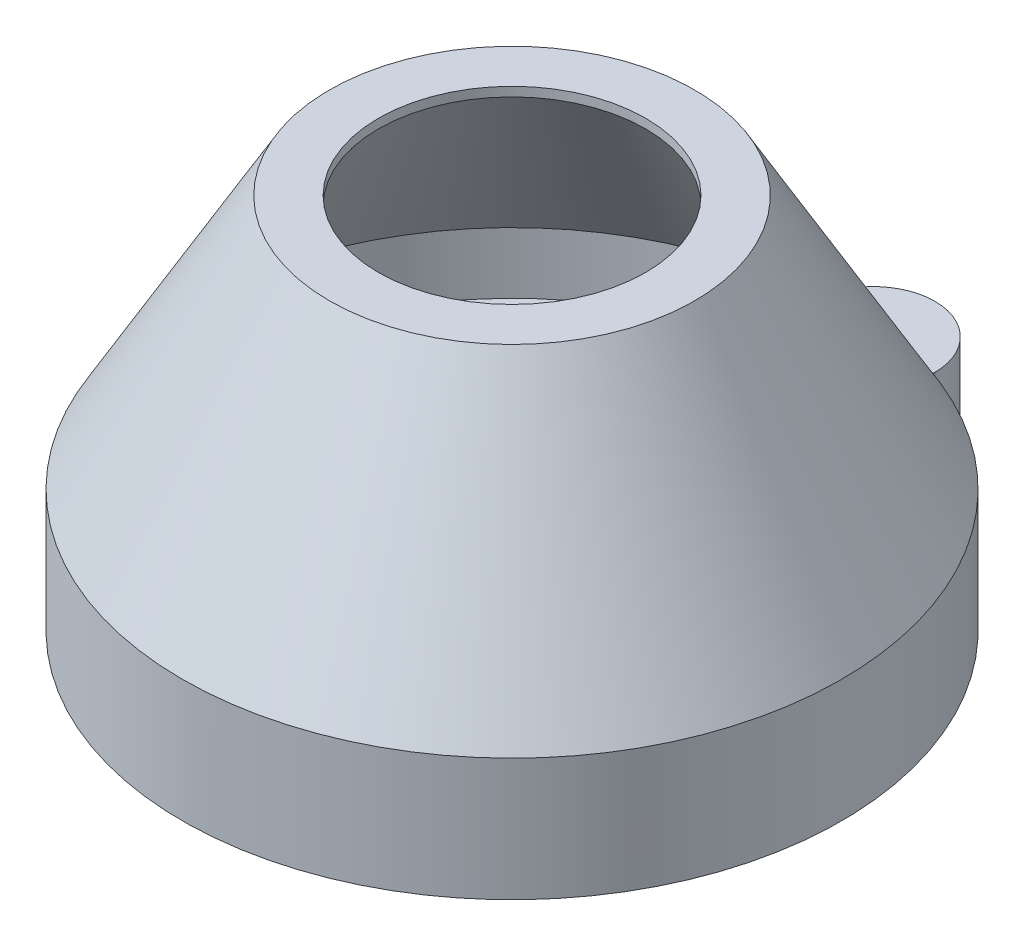
ISO-10303-21;
HEADER;
FILE_DESCRIPTION(('STEP AP214'),'2;1');
FILE_NAME('part.step','',(''),(''),'','','');
FILE_SCHEMA(('AUTOMOTIVE_DESIGN { 1 0 10303 214 1 1 1 1 }'));
ENDSEC;
DATA;
#1=APPLICATION_CONTEXT('core data for automotive mechanical design processes');
#2=APPLICATION_PROTOCOL_DEFINITION('international standard','automotive_design',2000,#1);
#3=PRODUCT_CONTEXT('',#1,'mechanical');
#4=PRODUCT('Part','Part','',(#3));
#5=PRODUCT_RELATED_PRODUCT_CATEGORY('part','',(#4));
#6=PRODUCT_DEFINITION_FORMATION('','',#4);
#7=PRODUCT_DEFINITION_CONTEXT('part definition',#1,'design');
#8=PRODUCT_DEFINITION('design','',#6,#7);
#9=PRODUCT_DEFINITION_SHAPE('','',#8);
#10=(LENGTH_UNIT() NAMED_UNIT(*) SI_UNIT(.MILLI.,.METRE.));
#11=(NAMED_UNIT(*) PLANE_ANGLE_UNIT() SI_UNIT($,.RADIAN.));
#12=(NAMED_UNIT(*) SI_UNIT($,.STERADIAN.) SOLID_ANGLE_UNIT());
#13=UNCERTAINTY_MEASURE_WITH_UNIT(LENGTH_MEASURE(1.E-05),#10,'distance_accuracy_value','');
#14=(GEOMETRIC_REPRESENTATION_CONTEXT(3) GLOBAL_UNCERTAINTY_ASSIGNED_CONTEXT((#13)) GLOBAL_UNIT_ASSIGNED_CONTEXT((#10,
#11,#12)) REPRESENTATION_CONTEXT('',''));
#15=CARTESIAN_POINT('',(0.,0.,0.));
#16=DIRECTION('',(0.,0.,1.));
#17=DIRECTION('',(1.,0.,0.));
#18=AXIS2_PLACEMENT_3D('',#15,#16,#17);
#19=CARTESIAN_POINT('',(0.,10.,0.));
#20=DIRECTION('',(0.,-1.,0.));
#21=DIRECTION('',(0.,0.,-1.));
#22=AXIS2_PLACEMENT_3D('',#19,#20,#21);
#23=CYLINDRICAL_SURFACE('',#22,26.128);
#24=CARTESIAN_POINT('',(0.,10.,0.));
#25=DIRECTION('',(0.,1.,0.));
#26=DIRECTION('',(0.,0.,1.));
#27=AXIS2_PLACEMENT_3D('',#24,#25,#26);
#28=CIRCLE('',#27,26.128);
#29=CARTESIAN_POINT('',(0.,10.,26.128));
#30=VERTEX_POINT('',#29);
#31=EDGE_CURVE('E123',#30,#30,#28,.T.);
#32=ORIENTED_EDGE('',*,*,#31,.T.);
#33=EDGE_LOOP('',(#32));
#34=FACE_BOUND('',#33,.T.);
#35=CARTESIAN_POINT('',(0.,5.,0.));
#36=DIRECTION('',(0.,-1.,0.));
#37=DIRECTION('',(0.,0.,-1.));
#38=AXIS2_PLACEMENT_3D('',#35,#36,#37);
#39=CIRCLE('',#38,26.128);
#40=CARTESIAN_POINT('',(0.,5.,-26.128));
#41=VERTEX_POINT('',#40);
#42=EDGE_CURVE('E119',#41,#41,#39,.T.);
#43=ORIENTED_EDGE('',*,*,#42,.T.);
#44=EDGE_LOOP('',(#43));
#45=FACE_BOUND('',#44,.T.);
#46=ADVANCED_FACE('F34',(#34,#45),#23,.F.);
#47=CARTESIAN_POINT('',(-0.525640836433946,5.5,-29.9953946750342));
#48=DIRECTION('',(0.,-1.,0.));
#49=DIRECTION('',(0.,0.,-1.));
#50=AXIS2_PLACEMENT_3D('',#47,#48,#49);
#51=CYLINDRICAL_SURFACE('',#50,1.5);
#52=CARTESIAN_POINT('',(-0.525640836433946,5.5,-29.9953946750342));
#53=DIRECTION('',(0.,-1.,0.));
#54=DIRECTION('',(0.,0.,-1.));
#55=AXIS2_PLACEMENT_3D('',#52,#53,#54);
#56=CIRCLE('',#55,1.5);
#57=CARTESIAN_POINT('',(-0.525640836433946,5.5,-31.4953946750343));
#58=VERTEX_POINT('',#57);
#59=EDGE_CURVE('E159',#58,#58,#56,.T.);
#60=ORIENTED_EDGE('',*,*,#59,.F.);
#61=EDGE_LOOP('',(#60));
#62=FACE_BOUND('',#61,.T.);
#63=CARTESIAN_POINT('',(-0.525640836433946,3.5,-29.9953946750342));
#64=DIRECTION('',(0.,-1.,0.));
#65=DIRECTION('',(0.,0.,-1.));
#66=AXIS2_PLACEMENT_3D('',#63,#64,#65);
#67=CIRCLE('',#66,1.5);
#68=CARTESIAN_POINT('',(-0.525640836433946,3.5,-31.4953946750343));
#69=VERTEX_POINT('',#68);
#70=EDGE_CURVE('E156',#69,#69,#67,.F.);
#71=ORIENTED_EDGE('',*,*,#70,.F.);
#72=EDGE_LOOP('',(#71));
#73=FACE_BOUND('',#72,.T.);
#74=ADVANCED_FACE('F198',(#62,#73),#51,.F.);
#75=CARTESIAN_POINT('',(0.,0.,0.));
#76=DIRECTION('',(0.,1.,0.));
#77=DIRECTION('',(0.,0.,1.));
#78=AXIS2_PLACEMENT_3D('',#75,#76,#77);
#79=PLANE('',#78);
#80=CARTESIAN_POINT('',(0.,0.,0.));
#81=DIRECTION('',(0.,1.,0.));
#82=DIRECTION('',(0.,0.,1.));
#83=AXIS2_PLACEMENT_3D('',#80,#81,#82);
#84=CIRCLE('',#83,26.878);
#85=CARTESIAN_POINT('',(-5.54316219764841,0.,-26.3001946162108));
#86=VERTEX_POINT('',#85);
#87=CARTESIAN_POINT('',(4.49188052477975,0.,-26.4999979877566));
#88=VERTEX_POINT('',#87);
#89=EDGE_CURVE('E189',#86,#88,#84,.T.);
#90=ORIENTED_EDGE('',*,*,#89,.F.);
#91=DIRECTION('',(0.,0.,-1.));
#92=VECTOR('',#91,1.);
#93=CARTESIAN_POINT('',(-5.54316219764841,0.,-29.9953946750342));
#94=LINE('',#93,#92);
#95=CARTESIAN_POINT('',(-5.54316219764841,0.,-29.9953946750342));
#96=VERTEX_POINT('',#95);
#97=EDGE_CURVE('E167',#86,#96,#94,.T.);
#98=ORIENTED_EDGE('',*,*,#97,.T.);
#99=CARTESIAN_POINT('',(-0.525640836433946,0.,-29.9953946750342));
#100=DIRECTION('',(0.,-1.,0.));
#101=DIRECTION('',(0.,0.,-1.));
#102=AXIS2_PLACEMENT_3D('',#99,#100,#101);
#103=CIRCLE('',#102,5.01752136121446);
#104=CARTESIAN_POINT('',(4.49188052478052,0.,-29.9953946750342));
#105=VERTEX_POINT('',#104);
#106=EDGE_CURVE('E162',#96,#105,#103,.T.);
#107=ORIENTED_EDGE('',*,*,#106,.T.);
#108=DIRECTION('',(0.,0.,1.));
#109=VECTOR('',#108,1.);
#110=CARTESIAN_POINT('',(4.49188052478052,0.,-29.9953946750342));
#111=LINE('',#110,#109);
#112=EDGE_CURVE('E176',#105,#88,#111,.T.);
#113=ORIENTED_EDGE('',*,*,#112,.T.);
#114=EDGE_LOOP('',(#90,#98,#107,#113));
#115=FACE_BOUND('',#114,.T.);
#116=CARTESIAN_POINT('',(-0.525640836433946,0.,-29.9953946750342));
#117=DIRECTION('',(0.,-1.,0.));
#118=DIRECTION('',(0.,0.,-1.));
#119=AXIS2_PLACEMENT_3D('',#116,#117,#118);
#120=CIRCLE('',#119,4.1844923609099);
#121=CARTESIAN_POINT('',(-4.71013319734384,0.,-29.9953946750342));
#122=VERTEX_POINT('',#121);
#123=CARTESIAN_POINT('',(3.65885152447595,0.,-29.9953946750342));
#124=VERTEX_POINT('',#123);
#125=EDGE_CURVE('E144',#122,#124,#120,.T.);
#126=ORIENTED_EDGE('',*,*,#125,.F.);
#127=DIRECTION('',(0.,0.,-1.));
#128=VECTOR('',#127,1.);
#129=CARTESIAN_POINT('',(-4.71013319734384,0.,-29.9953946750342));
#130=LINE('',#129,#128);
#131=CARTESIAN_POINT('',(-4.71013319734384,0.,-25.6999422035008));
#132=VERTEX_POINT('',#131);
#133=EDGE_CURVE('E145',#132,#122,#130,.T.);
#134=ORIENTED_EDGE('',*,*,#133,.F.);
#135=CARTESIAN_POINT('',(0.,0.,0.));
#136=DIRECTION('',(0.,1.,0.));
#137=DIRECTION('',(0.,0.,1.));
#138=AXIS2_PLACEMENT_3D('',#135,#136,#137);
#139=CIRCLE('',#138,26.128);
#140=CARTESIAN_POINT('',(3.65885152447595,0.,-25.8705467573038));
#141=VERTEX_POINT('',#140);
#142=EDGE_CURVE('E183',#132,#141,#139,.T.);
#143=ORIENTED_EDGE('',*,*,#142,.T.);
#144=DIRECTION('',(0.,0.,1.));
#145=VECTOR('',#144,1.);
#146=CARTESIAN_POINT('',(3.65885152447595,0.,-29.9953946750342));
#147=LINE('',#146,#145);
#148=EDGE_CURVE('E101',#124,#141,#147,.T.);
#149=ORIENTED_EDGE('',*,*,#148,.F.);
#150=EDGE_LOOP('',(#126,#134,#143,#149));
#151=FACE_BOUND('',#150,.T.);
#152=ADVANCED_FACE('F200',(#115,#151),#79,.F.);
#153=CARTESIAN_POINT('',(0.,10.,0.));
#154=DIRECTION('',(0.,-1.,0.));
#155=DIRECTION('',(0.,0.,-1.));
#156=AXIS2_PLACEMENT_3D('',#153,#154,#155);
#157=CYLINDRICAL_SURFACE('',#156,26.878);
#158=CARTESIAN_POINT('',(0.,10.,0.));
#159=DIRECTION('',(0.,1.,0.));
#160=DIRECTION('',(0.,0.,1.));
#161=AXIS2_PLACEMENT_3D('',#158,#159,#160);
#162=CIRCLE('',#161,26.878);
#163=CARTESIAN_POINT('',(0.,10.,26.878));
#164=VERTEX_POINT('',#163);
#165=EDGE_CURVE('E190',#164,#164,#162,.T.);
#166=ORIENTED_EDGE('',*,*,#165,.F.);
#167=EDGE_LOOP('',(#166));
#168=FACE_BOUND('',#167,.T.);
#169=CARTESIAN_POINT('',(0.,5.5,0.));
#170=DIRECTION('',(0.,-1.,0.));
#171=DIRECTION('',(0.,0.,-1.));
#172=AXIS2_PLACEMENT_3D('',#169,#170,#171);
#173=CIRCLE('',#172,26.878);
#174=CARTESIAN_POINT('',(-5.54316219764845,5.5,-26.3001946162108));
#175=VERTEX_POINT('',#174);
#176=CARTESIAN_POINT('',(4.49188052477975,5.5,-26.4999979877566));
#177=VERTEX_POINT('',#176);
#178=EDGE_CURVE('E42',#175,#177,#173,.T.);
#179=ORIENTED_EDGE('',*,*,#178,.F.);
#180=DIRECTION('',(0.,-1.,0.));
#181=VECTOR('',#180,1.);
#182=CARTESIAN_POINT('',(-5.54316219764841,5.5,-26.3001946162108));
#183=LINE('',#182,#181);
#184=EDGE_CURVE('E184',#175,#86,#183,.T.);
#185=ORIENTED_EDGE('',*,*,#184,.T.);
#186=ORIENTED_EDGE('',*,*,#89,.T.);
#187=DIRECTION('',(0.,-1.,0.));
#188=VECTOR('',#187,1.);
#189=CARTESIAN_POINT('',(4.49188052478053,5.5,-26.4999979877565));
#190=LINE('',#189,#188);
#191=EDGE_CURVE('E49',#177,#88,#190,.T.);
#192=ORIENTED_EDGE('',*,*,#191,.F.);
#193=EDGE_LOOP('',(#179,#185,#186,#192));
#194=FACE_BOUND('',#193,.T.);
#195=ADVANCED_FACE('F36',(#168,#194),#157,.T.);
#196=CARTESIAN_POINT('',(0.,3.5,0.));
#197=DIRECTION('',(0.,-1.,0.));
#198=DIRECTION('',(0.,0.,-1.));
#199=AXIS2_PLACEMENT_3D('',#196,#197,#198);
#200=CIRCLE('',#199,26.128);
#201=CARTESIAN_POINT('',(3.65885152447595,3.5,-25.8705467573038));
#202=VERTEX_POINT('',#201);
#203=CARTESIAN_POINT('',(-4.71013319734384,3.5,-25.6999422035008));
#204=VERTEX_POINT('',#203);
#205=EDGE_CURVE('E111',#202,#204,#200,.T.);
#206=ORIENTED_EDGE('',*,*,#205,.F.);
#207=DIRECTION('',(0.,-1.,0.));
#208=VECTOR('',#207,1.);
#209=CARTESIAN_POINT('',(3.65885152447595,10.,-25.8705467573038));
#210=LINE('',#209,#208);
#211=EDGE_CURVE('E11',#141,#202,#210,.F.);
#212=ORIENTED_EDGE('',*,*,#211,.F.);
#213=ORIENTED_EDGE('',*,*,#142,.F.);
#214=DIRECTION('',(0.,-1.,0.));
#215=VECTOR('',#214,1.);
#216=CARTESIAN_POINT('',(-4.71013319734384,3.5,-25.6999422035008));
#217=LINE('',#216,#215);
#218=EDGE_CURVE('E118',#204,#132,#217,.T.);
#219=ORIENTED_EDGE('',*,*,#218,.F.);
#220=EDGE_LOOP('',(#206,#212,#213,#219));
#221=FACE_BOUND('',#220,.T.);
#222=ADVANCED_FACE('F117',(#221),#23,.F.);
#223=CARTESIAN_POINT('',(-0.525640836433946,5.5,-29.9953946750342));
#224=DIRECTION('',(0.,-1.,0.));
#225=DIRECTION('',(0.,0.,-1.));
#226=AXIS2_PLACEMENT_3D('',#223,#224,#225);
#227=PLANE('',#226);
#228=ORIENTED_EDGE('',*,*,#59,.T.);
#229=EDGE_LOOP('',(#228));
#230=FACE_BOUND('',#229,.T.);
#231=DIRECTION('',(0.,0.,-1.));
#232=VECTOR('',#231,1.);
#233=CARTESIAN_POINT('',(-5.54316219764841,5.5,-29.9953946750342));
#234=LINE('',#233,#232);
#235=CARTESIAN_POINT('',(-5.54316219764841,5.5,-29.9953946750342));
#236=VERTEX_POINT('',#235);
#237=EDGE_CURVE('E170',#175,#236,#234,.T.);
#238=ORIENTED_EDGE('',*,*,#237,.F.);
#239=ORIENTED_EDGE('',*,*,#178,.T.);
#240=DIRECTION('',(0.,0.,1.));
#241=VECTOR('',#240,1.);
#242=CARTESIAN_POINT('',(4.49188052478052,5.5,-29.9953946750342));
#243=LINE('',#242,#241);
#244=CARTESIAN_POINT('',(4.49188052478052,5.5,-29.9953946750342));
#245=VERTEX_POINT('',#244);
#246=EDGE_CURVE('E166',#245,#177,#243,.T.);
#247=ORIENTED_EDGE('',*,*,#246,.F.);
#248=CARTESIAN_POINT('',(-0.525640836433946,5.5,-29.9953946750342));
#249=DIRECTION('',(0.,-1.,0.));
#250=DIRECTION('',(0.,0.,-1.));
#251=AXIS2_PLACEMENT_3D('',#248,#249,#250);
#252=CIRCLE('',#251,5.01752136121446);
#253=EDGE_CURVE('E163',#236,#245,#252,.T.);
#254=ORIENTED_EDGE('',*,*,#253,.F.);
#255=EDGE_LOOP('',(#238,#239,#247,#254));
#256=FACE_BOUND('',#255,.T.);
#257=ADVANCED_FACE('F215',(#230,#256),#227,.F.);
#258=CARTESIAN_POINT('',(-0.525640836433946,5.5,-29.9953946750342));
#259=DIRECTION('',(0.,-1.,0.));
#260=DIRECTION('',(0.,0.,-1.));
#261=AXIS2_PLACEMENT_3D('',#258,#259,#260);
#262=CYLINDRICAL_SURFACE('',#261,5.01752136121446);
#263=ORIENTED_EDGE('',*,*,#106,.F.);
#264=DIRECTION('',(0.,-1.,0.));
#265=VECTOR('',#264,1.);
#266=CARTESIAN_POINT('',(-5.54316219764841,5.5,-29.9953946750342));
#267=LINE('',#266,#265);
#268=EDGE_CURVE('E181',#236,#96,#267,.T.);
#269=ORIENTED_EDGE('',*,*,#268,.F.);
#270=ORIENTED_EDGE('',*,*,#253,.T.);
#271=DIRECTION('',(0.,-1.,0.));
#272=VECTOR('',#271,1.);
#273=CARTESIAN_POINT('',(4.49188052478052,5.5,-29.9953946750342));
#274=LINE('',#273,#272);
#275=EDGE_CURVE('E173',#245,#105,#274,.T.);
#276=ORIENTED_EDGE('',*,*,#275,.T.);
#277=EDGE_LOOP('',(#263,#269,#270,#276));
#278=FACE_BOUND('',#277,.T.);
#279=ADVANCED_FACE('F218',(#278),#262,.T.);
#280=CARTESIAN_POINT('',(-5.54316219764841,5.5,-29.9953946750342));
#281=DIRECTION('',(-1.,0.,0.));
#282=DIRECTION('',(0.,0.,1.));
#283=AXIS2_PLACEMENT_3D('',#280,#281,#282);
#284=PLANE('',#283);
#285=ORIENTED_EDGE('',*,*,#97,.F.);
#286=ORIENTED_EDGE('',*,*,#184,.F.);
#287=ORIENTED_EDGE('',*,*,#237,.T.);
#288=ORIENTED_EDGE('',*,*,#268,.T.);
#289=EDGE_LOOP('',(#285,#286,#287,#288));
#290=FACE_BOUND('',#289,.T.);
#291=ADVANCED_FACE('F220',(#290),#284,.T.);
#292=CARTESIAN_POINT('',(4.49188052478052,5.5,-29.9953946750342));
#293=DIRECTION('',(1.,0.,0.));
#294=DIRECTION('',(0.,0.,-1.));
#295=AXIS2_PLACEMENT_3D('',#292,#293,#294);
#296=PLANE('',#295);
#297=ORIENTED_EDGE('',*,*,#112,.F.);
#298=ORIENTED_EDGE('',*,*,#275,.F.);
#299=ORIENTED_EDGE('',*,*,#246,.T.);
#300=ORIENTED_EDGE('',*,*,#191,.T.);
#301=EDGE_LOOP('',(#297,#298,#299,#300));
#302=FACE_BOUND('',#301,.T.);
#303=ADVANCED_FACE('F223',(#302),#296,.T.);
#304=CARTESIAN_POINT('',(-0.525640836433946,3.5,-29.9953946750342));
#305=DIRECTION('',(0.,-1.,0.));
#306=DIRECTION('',(0.,0.,-1.));
#307=AXIS2_PLACEMENT_3D('',#304,#305,#306);
#308=PLANE('',#307);
#309=DIRECTION('',(0.,0.,-1.));
#310=VECTOR('',#309,1.);
#311=CARTESIAN_POINT('',(-4.71013319734384,3.5,-29.9953946750342));
#312=LINE('',#311,#310);
#313=CARTESIAN_POINT('',(-4.71013319734384,3.5,-29.9953946750342));
#314=VERTEX_POINT('',#313);
#315=EDGE_CURVE('E114',#204,#314,#312,.T.);
#316=ORIENTED_EDGE('',*,*,#315,.T.);
#317=CARTESIAN_POINT('',(-0.525640836433946,3.5,-29.9953946750342));
#318=DIRECTION('',(0.,-1.,0.));
#319=DIRECTION('',(0.,0.,-1.));
#320=AXIS2_PLACEMENT_3D('',#317,#318,#319);
#321=CIRCLE('',#320,4.1844923609099);
#322=CARTESIAN_POINT('',(3.65885152447595,3.5,-29.9953946750342));
#323=VERTEX_POINT('',#322);
#324=EDGE_CURVE('E113',#314,#323,#321,.T.);
#325=ORIENTED_EDGE('',*,*,#324,.T.);
#326=DIRECTION('',(0.,0.,1.));
#327=VECTOR('',#326,1.);
#328=CARTESIAN_POINT('',(3.65885152447595,3.5,-29.9953946750342));
#329=LINE('',#328,#327);
#330=EDGE_CURVE('E98',#323,#202,#329,.T.);
#331=ORIENTED_EDGE('',*,*,#330,.T.);
#332=ORIENTED_EDGE('',*,*,#205,.T.);
#333=EDGE_LOOP('',(#316,#325,#331,#332));
#334=FACE_BOUND('',#333,.T.);
#335=ORIENTED_EDGE('',*,*,#70,.T.);
#336=EDGE_LOOP('',(#335));
#337=FACE_BOUND('',#336,.T.);
#338=CARTESIAN_POINT('',(0.,3.5,0.));
#339=DIRECTION('',(0.,-1.,0.));
#340=DIRECTION('',(0.,0.,-1.));
#341=AXIS2_PLACEMENT_3D('',#338,#339,#340);
#342=CIRCLE('',#341,25.5);
#343=CARTESIAN_POINT('',(0.,3.5,-25.5));
#344=VERTEX_POINT('',#343);
#345=EDGE_CURVE('E126',#344,#344,#342,.T.);
#346=ORIENTED_EDGE('',*,*,#345,.F.);
#347=EDGE_LOOP('',(#346));
#348=FACE_BOUND('',#347,.T.);
#349=ADVANCED_FACE('F109',(#334,#337,#348),#308,.T.);
#350=CARTESIAN_POINT('',(-0.525640836433946,3.5,-29.9953946750342));
#351=DIRECTION('',(0.,-1.,0.));
#352=DIRECTION('',(0.,0.,-1.));
#353=AXIS2_PLACEMENT_3D('',#350,#351,#352);
#354=CYLINDRICAL_SURFACE('',#353,4.1844923609099);
#355=ORIENTED_EDGE('',*,*,#125,.T.);
#356=DIRECTION('',(0.,-1.,0.));
#357=VECTOR('',#356,1.);
#358=CARTESIAN_POINT('',(3.65885152447595,3.5,-29.9953946750342));
#359=LINE('',#358,#357);
#360=EDGE_CURVE('E148',#323,#124,#359,.T.);
#361=ORIENTED_EDGE('',*,*,#360,.F.);
#362=ORIENTED_EDGE('',*,*,#324,.F.);
#363=DIRECTION('',(0.,-1.,0.));
#364=VECTOR('',#363,1.);
#365=CARTESIAN_POINT('',(-4.71013319734384,3.5,-29.9953946750342));
#366=LINE('',#365,#364);
#367=EDGE_CURVE('E154',#314,#122,#366,.T.);
#368=ORIENTED_EDGE('',*,*,#367,.T.);
#369=EDGE_LOOP('',(#355,#361,#362,#368));
#370=FACE_BOUND('',#369,.T.);
#371=ADVANCED_FACE('F213',(#370),#354,.F.);
#372=CARTESIAN_POINT('',(-4.71013319734384,3.5,-29.9953946750342));
#373=DIRECTION('',(-1.,0.,0.));
#374=DIRECTION('',(0.,0.,1.));
#375=AXIS2_PLACEMENT_3D('',#372,#373,#374);
#376=PLANE('',#375);
#377=ORIENTED_EDGE('',*,*,#133,.T.);
#378=ORIENTED_EDGE('',*,*,#367,.F.);
#379=ORIENTED_EDGE('',*,*,#315,.F.);
#380=ORIENTED_EDGE('',*,*,#218,.T.);
#381=EDGE_LOOP('',(#377,#378,#379,#380));
#382=FACE_BOUND('',#381,.T.);
#383=ADVANCED_FACE('F284',(#382),#376,.F.);
#384=CARTESIAN_POINT('',(3.65885152447595,3.5,-29.9953946750342));
#385=DIRECTION('',(1.,0.,0.));
#386=DIRECTION('',(0.,0.,-1.));
#387=AXIS2_PLACEMENT_3D('',#384,#385,#386);
#388=PLANE('',#387);
#389=ORIENTED_EDGE('',*,*,#211,.T.);
#390=ORIENTED_EDGE('',*,*,#330,.F.);
#391=ORIENTED_EDGE('',*,*,#360,.T.);
#392=ORIENTED_EDGE('',*,*,#148,.T.);
#393=EDGE_LOOP('',(#389,#390,#391,#392));
#394=FACE_BOUND('',#393,.T.);
#395=ADVANCED_FACE('F97',(#394),#388,.F.);
#396=CARTESIAN_POINT('',(0.,30.75,0.));
#397=DIRECTION('',(0.,-1.,0.));
#398=DIRECTION('',(0.,0.,-1.));
#399=AXIS2_PLACEMENT_3D('',#396,#397,#398);
#400=CONICAL_SURFACE('',#399,14.8979819143152,0.523598775598304);
#401=ORIENTED_EDGE('',*,*,#165,.T.);
#402=EDGE_LOOP('',(#401));
#403=FACE_BOUND('',#402,.T.);
#404=CARTESIAN_POINT('',(0.,30.75,0.));
#405=DIRECTION('',(0.,1.,0.));
#406=DIRECTION('',(0.,0.,1.));
#407=AXIS2_PLACEMENT_3D('',#404,#405,#406);
#408=CIRCLE('',#407,14.8979819143152);
#409=CARTESIAN_POINT('',(0.,30.75,14.8979819143152));
#410=VERTEX_POINT('',#409);
#411=EDGE_CURVE('E141',#410,#410,#408,.T.);
#412=ORIENTED_EDGE('',*,*,#411,.F.);
#413=EDGE_LOOP('',(#412));
#414=FACE_BOUND('',#413,.T.);
#415=ADVANCED_FACE('F239',(#403,#414),#400,.T.);
#416=CARTESIAN_POINT('',(-10.8979819143152,30.75,0.));
#417=DIRECTION('',(0.,1.,0.));
#418=DIRECTION('',(0.,0.,1.));
#419=AXIS2_PLACEMENT_3D('',#416,#417,#418);
#420=PLANE('',#419);
#421=ORIENTED_EDGE('',*,*,#411,.T.);
#422=EDGE_LOOP('',(#421));
#423=FACE_BOUND('',#422,.T.);
#424=CARTESIAN_POINT('',(0.,30.75,0.));
#425=DIRECTION('',(0.,1.,0.));
#426=DIRECTION('',(0.,0.,1.));
#427=AXIS2_PLACEMENT_3D('',#424,#425,#426);
#428=CIRCLE('',#427,10.8979819143152);
#429=CARTESIAN_POINT('',(0.,30.75,10.8979819143152));
#430=VERTEX_POINT('',#429);
#431=EDGE_CURVE('E138',#430,#430,#428,.T.);
#432=ORIENTED_EDGE('',*,*,#431,.F.);
#433=EDGE_LOOP('',(#432));
#434=FACE_BOUND('',#433,.T.);
#435=ADVANCED_FACE('F242',(#423,#434),#420,.T.);
#436=CARTESIAN_POINT('',(0.,30.1875,0.));
#437=DIRECTION('',(0.,1.,0.));
#438=DIRECTION('',(0.,0.,1.));
#439=AXIS2_PLACEMENT_3D('',#436,#437,#438);
#440=CYLINDRICAL_SURFACE('',#439,10.8979819143152);
#441=ORIENTED_EDGE('',*,*,#431,.T.);
#442=EDGE_LOOP('',(#441));
#443=FACE_BOUND('',#442,.T.);
#444=CARTESIAN_POINT('',(0.,30.,0.));
#445=DIRECTION('',(0.,1.,0.));
#446=DIRECTION('',(0.,0.,1.));
#447=AXIS2_PLACEMENT_3D('',#444,#445,#446);
#448=CIRCLE('',#447,10.8979819143152);
#449=CARTESIAN_POINT('',(0.,30.,10.8979819143152));
#450=VERTEX_POINT('',#449);
#451=EDGE_CURVE('E135',#450,#450,#448,.T.);
#452=ORIENTED_EDGE('',*,*,#451,.F.);
#453=EDGE_LOOP('',(#452));
#454=FACE_BOUND('',#453,.T.);
#455=ADVANCED_FACE('F248',(#443,#454),#440,.F.);
#456=CARTESIAN_POINT('',(-14.5809946162076,30.,0.));
#457=DIRECTION('',(0.,-1.,0.));
#458=DIRECTION('',(0.,0.,-1.));
#459=AXIS2_PLACEMENT_3D('',#456,#457,#458);
#460=PLANE('',#459);
#461=ORIENTED_EDGE('',*,*,#451,.T.);
#462=EDGE_LOOP('',(#461));
#463=FACE_BOUND('',#462,.T.);
#464=CARTESIAN_POINT('',(0.,30.,0.));
#465=DIRECTION('',(0.,1.,0.));
#466=DIRECTION('',(0.,0.,1.));
#467=AXIS2_PLACEMENT_3D('',#464,#465,#466);
#468=CIRCLE('',#467,14.5809946162076);
#469=CARTESIAN_POINT('',(0.,30.,14.5809946162076));
#470=VERTEX_POINT('',#469);
#471=EDGE_CURVE('E132',#470,#470,#468,.T.);
#472=ORIENTED_EDGE('',*,*,#471,.F.);
#473=EDGE_LOOP('',(#472));
#474=FACE_BOUND('',#473,.T.);
#475=ADVANCED_FACE('F254',(#463,#474),#460,.T.);
#476=CARTESIAN_POINT('',(0.,10.,0.));
#477=DIRECTION('',(0.,-1.,0.));
#478=DIRECTION('',(0.,0.,-1.));
#479=AXIS2_PLACEMENT_3D('',#476,#477,#478);
#480=CONICAL_SURFACE('',#479,26.128,0.523598775598296);
#481=ORIENTED_EDGE('',*,*,#471,.T.);
#482=EDGE_LOOP('',(#481));
#483=FACE_BOUND('',#482,.T.);
#484=ORIENTED_EDGE('',*,*,#31,.F.);
#485=EDGE_LOOP('',(#484));
#486=FACE_BOUND('',#485,.T.);
#487=ADVANCED_FACE('F260',(#483,#486),#480,.F.);
#488=CARTESIAN_POINT('',(0.,5.,0.));
#489=DIRECTION('',(0.,-1.,0.));
#490=DIRECTION('',(0.,0.,-1.));
#491=AXIS2_PLACEMENT_3D('',#488,#489,#490);
#492=PLANE('',#491);
#493=CARTESIAN_POINT('',(0.,5.,0.));
#494=DIRECTION('',(0.,-1.,0.));
#495=DIRECTION('',(0.,0.,-1.));
#496=AXIS2_PLACEMENT_3D('',#493,#494,#495);
#497=CIRCLE('',#496,25.5);
#498=CARTESIAN_POINT('',(0.,5.,-25.5));
#499=VERTEX_POINT('',#498);
#500=EDGE_CURVE('E120',#499,#499,#497,.T.);
#501=ORIENTED_EDGE('',*,*,#500,.T.);
#502=EDGE_LOOP('',(#501));
#503=FACE_BOUND('',#502,.T.);
#504=ORIENTED_EDGE('',*,*,#42,.F.);
#505=EDGE_LOOP('',(#504));
#506=FACE_BOUND('',#505,.T.);
#507=ADVANCED_FACE('F266',(#503,#506),#492,.F.);
#508=CARTESIAN_POINT('',(0.,5.,0.));
#509=DIRECTION('',(0.,-1.,0.));
#510=DIRECTION('',(0.,0.,-1.));
#511=AXIS2_PLACEMENT_3D('',#508,#509,#510);
#512=CYLINDRICAL_SURFACE('',#511,25.5);
#513=ORIENTED_EDGE('',*,*,#500,.F.);
#514=EDGE_LOOP('',(#513));
#515=FACE_BOUND('',#514,.T.);
#516=ORIENTED_EDGE('',*,*,#345,.T.);
#517=EDGE_LOOP('',(#516));
#518=FACE_BOUND('',#517,.T.);
#519=ADVANCED_FACE('F273',(#515,#518),#512,.F.);
#520=CLOSED_SHELL('',(#46,#74,#152,#195,#222,#257,#279,#291,#303,#349,#371,#383,#395,#415,#435,
#455,#475,#487,#507,#519));
#521=MANIFOLD_SOLID_BREP('B2',#520);
#522=ADVANCED_BREP_SHAPE_REPRESENTATION('',(#18,#521),#14);
#523=SHAPE_DEFINITION_REPRESENTATION(#9,#522);
ENDSEC;
END-ISO-10303-21;
